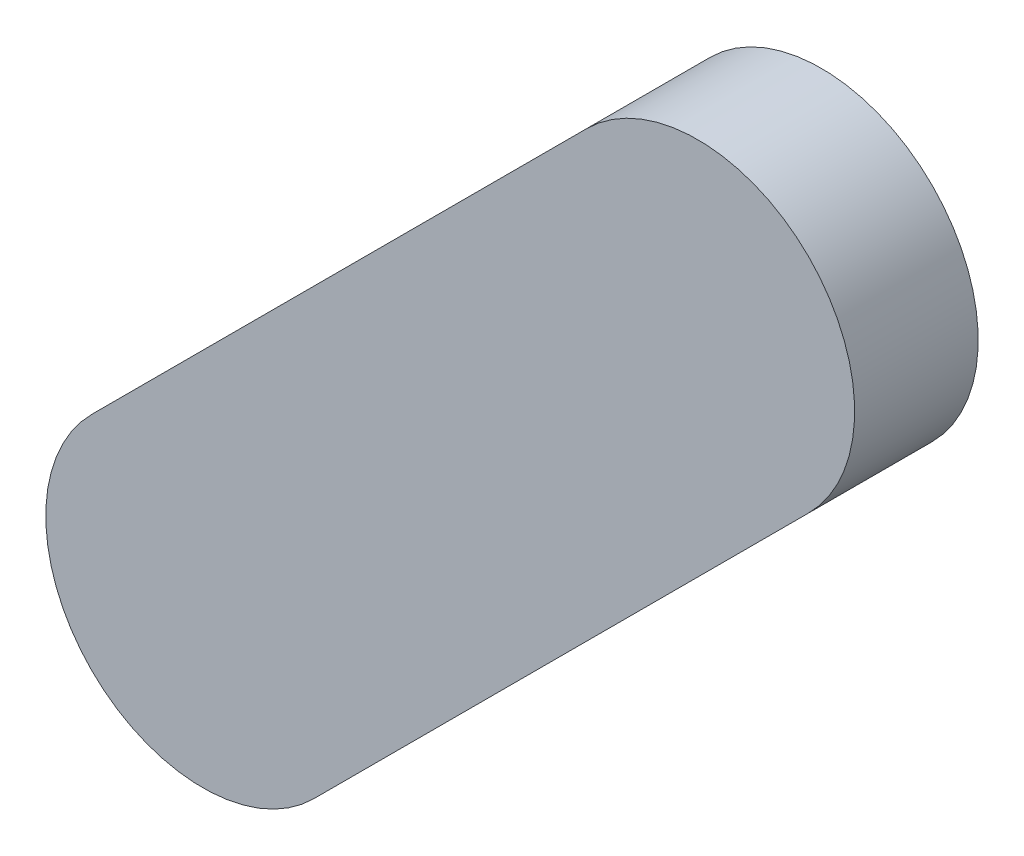
ISO-10303-21;
HEADER;
FILE_DESCRIPTION(('STEP AP214'),'2;1');
FILE_NAME('part.step','',(''),(''),'','','');
FILE_SCHEMA(('AUTOMOTIVE_DESIGN { 1 0 10303 214 1 1 1 1 }'));
ENDSEC;
DATA;
#1=APPLICATION_CONTEXT('core data for automotive mechanical design processes');
#2=APPLICATION_PROTOCOL_DEFINITION('international standard','automotive_design',2000,#1);
#3=PRODUCT_CONTEXT('',#1,'mechanical');
#4=PRODUCT('Part','Part','',(#3));
#5=PRODUCT_RELATED_PRODUCT_CATEGORY('part','',(#4));
#6=PRODUCT_DEFINITION_FORMATION('','',#4);
#7=PRODUCT_DEFINITION_CONTEXT('part definition',#1,'design');
#8=PRODUCT_DEFINITION('design','',#6,#7);
#9=PRODUCT_DEFINITION_SHAPE('','',#8);
#10=(LENGTH_UNIT() NAMED_UNIT(*) SI_UNIT(.MILLI.,.METRE.));
#11=(NAMED_UNIT(*) PLANE_ANGLE_UNIT() SI_UNIT($,.RADIAN.));
#12=(NAMED_UNIT(*) SI_UNIT($,.STERADIAN.) SOLID_ANGLE_UNIT());
#13=UNCERTAINTY_MEASURE_WITH_UNIT(LENGTH_MEASURE(1.E-05),#10,'distance_accuracy_value','');
#14=(GEOMETRIC_REPRESENTATION_CONTEXT(3) GLOBAL_UNCERTAINTY_ASSIGNED_CONTEXT((#13)) GLOBAL_UNIT_ASSIGNED_CONTEXT((#10,
#11,#12)) REPRESENTATION_CONTEXT('',''));
#15=CARTESIAN_POINT('',(0.,0.,0.));
#16=DIRECTION('',(0.,0.,1.));
#17=DIRECTION('',(1.,0.,0.));
#18=AXIS2_PLACEMENT_3D('',#15,#16,#17);
#19=CARTESIAN_POINT('',(154.1915382,71.40932886,0.));
#20=DIRECTION('',(-0.70710566014808,0.707107902223238,0.));
#21=DIRECTION('',(0.707107902223238,0.70710566014808,0.));
#22=AXIS2_PLACEMENT_3D('',#19,#20,#21);
#23=PLANE('',#22);
#24=DIRECTION('',(0.707107902223238,0.70710566014808,0.));
#25=VECTOR('',#24,1.);
#26=CARTESIAN_POINT('',(154.1915382,71.40932886,0.1999996));
#27=LINE('',#26,#25);
#28=CARTESIAN_POINT('',(154.1915382,71.40932886,0.1999996));
#29=VERTEX_POINT('',#28);
#30=CARTESIAN_POINT('',(154.99260594,72.21039406,0.1999996));
#31=VERTEX_POINT('',#30);
#32=EDGE_CURVE('E11',#29,#31,#27,.T.);
#33=ORIENTED_EDGE('',*,*,#32,.F.);
#34=DIRECTION('',(0.,0.,1.));
#35=VECTOR('',#34,1.);
#36=CARTESIAN_POINT('',(154.1915382,71.40932886,0.));
#37=LINE('',#36,#35);
#38=CARTESIAN_POINT('',(154.1915382,71.40932886,0.));
#39=VERTEX_POINT('',#38);
#40=EDGE_CURVE('E24',#39,#29,#37,.T.);
#41=ORIENTED_EDGE('',*,*,#40,.F.);
#42=DIRECTION('',(0.707107902223238,0.70710566014808,0.));
#43=VECTOR('',#42,1.);
#44=CARTESIAN_POINT('',(154.1915382,71.40932886,0.));
#45=LINE('',#44,#43);
#46=CARTESIAN_POINT('',(154.99260594,72.21039406,0.));
#47=VERTEX_POINT('',#46);
#48=EDGE_CURVE('E75',#39,#47,#45,.T.);
#49=ORIENTED_EDGE('',*,*,#48,.T.);
#50=DIRECTION('',(0.,0.,1.));
#51=VECTOR('',#50,1.);
#52=CARTESIAN_POINT('',(154.99260594,72.21039406,0.));
#53=LINE('',#52,#51);
#54=EDGE_CURVE('E37',#47,#31,#53,.T.);
#55=ORIENTED_EDGE('',*,*,#54,.T.);
#56=EDGE_LOOP('',(#33,#41,#49,#55));
#57=FACE_BOUND('',#56,.T.);
#58=ADVANCED_FACE('F17',(#57),#23,.F.);
#59=CARTESIAN_POINT('',(154.813,72.39,0.));
#60=DIRECTION('',(0.,0.,-1.));
#61=DIRECTION('',(0.707106781186576,-0.70710678118652,0.));
#62=AXIS2_PLACEMENT_3D('',#59,#60,#61);
#63=CYLINDRICAL_SURFACE('',#62,0.254001156230781);
#64=CARTESIAN_POINT('',(154.813,72.39,0.1999996));
#65=DIRECTION('',(0.,0.,1.));
#66=DIRECTION('',(0.707106781186576,-0.70710678118652,0.));
#67=AXIS2_PLACEMENT_3D('',#64,#65,#66);
#68=CIRCLE('',#67,0.254001156230781);
#69=CARTESIAN_POINT('',(154.63339406,72.56960594,0.1999996));
#70=VERTEX_POINT('',#69);
#71=EDGE_CURVE('E83',#31,#70,#68,.T.);
#72=ORIENTED_EDGE('',*,*,#71,.F.);
#73=ORIENTED_EDGE('',*,*,#54,.F.);
#74=CARTESIAN_POINT('',(154.813,72.39,0.));
#75=DIRECTION('',(0.,0.,1.));
#76=DIRECTION('',(0.707106781186576,-0.70710678118652,0.));
#77=AXIS2_PLACEMENT_3D('',#74,#75,#76);
#78=CIRCLE('',#77,0.254001156230781);
#79=CARTESIAN_POINT('',(154.63339406,72.56960594,0.));
#80=VERTEX_POINT('',#79);
#81=EDGE_CURVE('E81',#47,#80,#78,.T.);
#82=ORIENTED_EDGE('',*,*,#81,.T.);
#83=DIRECTION('',(0.,0.,1.));
#84=VECTOR('',#83,1.);
#85=CARTESIAN_POINT('',(154.63339406,72.56960594,0.));
#86=LINE('',#85,#84);
#87=EDGE_CURVE('E67',#80,#70,#86,.T.);
#88=ORIENTED_EDGE('',*,*,#87,.T.);
#89=EDGE_LOOP('',(#72,#73,#82,#88));
#90=FACE_BOUND('',#89,.T.);
#91=ADVANCED_FACE('F89',(#90),#63,.T.);
#92=CARTESIAN_POINT('',(154.63339406,72.56960594,0.));
#93=DIRECTION('',(0.707107902223244,-0.707105660148074,0.));
#94=DIRECTION('',(-0.707105660148074,-0.707107902223244,0.));
#95=AXIS2_PLACEMENT_3D('',#92,#93,#94);
#96=PLANE('',#95);
#97=DIRECTION('',(-0.707105660148074,-0.707107902223244,0.));
#98=VECTOR('',#97,1.);
#99=CARTESIAN_POINT('',(154.63339406,72.56960594,0.1999996));
#100=LINE('',#99,#98);
#101=CARTESIAN_POINT('',(153.83232886,71.7685382,0.1999996));
#102=VERTEX_POINT('',#101);
#103=EDGE_CURVE('E71',#70,#102,#100,.T.);
#104=ORIENTED_EDGE('',*,*,#103,.F.);
#105=ORIENTED_EDGE('',*,*,#87,.F.);
#106=DIRECTION('',(-0.707105660148074,-0.707107902223244,0.));
#107=VECTOR('',#106,1.);
#108=CARTESIAN_POINT('',(154.63339406,72.56960594,0.));
#109=LINE('',#108,#107);
#110=CARTESIAN_POINT('',(153.83232886,71.7685382,0.));
#111=VERTEX_POINT('',#110);
#112=EDGE_CURVE('E63',#80,#111,#109,.T.);
#113=ORIENTED_EDGE('',*,*,#112,.T.);
#114=DIRECTION('',(0.,0.,1.));
#115=VECTOR('',#114,1.);
#116=CARTESIAN_POINT('',(153.83232886,71.7685382,0.));
#117=LINE('',#116,#115);
#118=EDGE_CURVE('E53',#111,#102,#117,.T.);
#119=ORIENTED_EDGE('',*,*,#118,.T.);
#120=EDGE_LOOP('',(#104,#105,#113,#119));
#121=FACE_BOUND('',#120,.T.);
#122=ADVANCED_FACE('F66',(#121),#96,.F.);
#123=CARTESIAN_POINT('',(154.01193353,71.58893353,0.));
#124=DIRECTION('',(0.,0.,-1.));
#125=DIRECTION('',(-0.707106781186548,0.707106781186548,0.));
#126=AXIS2_PLACEMENT_3D('',#123,#124,#125);
#127=CYLINDRICAL_SURFACE('',#126,0.253999360179542);
#128=CARTESIAN_POINT('',(154.01193353,71.58893353,0.1999996));
#129=DIRECTION('',(0.,0.,1.));
#130=DIRECTION('',(-0.707106781186548,0.707106781186548,0.));
#131=AXIS2_PLACEMENT_3D('',#128,#129,#130);
#132=CIRCLE('',#131,0.253999360179542);
#133=EDGE_CURVE('E59',#102,#29,#132,.T.);
#134=ORIENTED_EDGE('',*,*,#133,.F.);
#135=ORIENTED_EDGE('',*,*,#118,.F.);
#136=CARTESIAN_POINT('',(154.01193353,71.58893353,0.));
#137=DIRECTION('',(0.,0.,1.));
#138=DIRECTION('',(-0.707106781186548,0.707106781186548,0.));
#139=AXIS2_PLACEMENT_3D('',#136,#137,#138);
#140=CIRCLE('',#139,0.253999360179542);
#141=EDGE_CURVE('E57',#111,#39,#140,.T.);
#142=ORIENTED_EDGE('',*,*,#141,.T.);
#143=ORIENTED_EDGE('',*,*,#40,.T.);
#144=EDGE_LOOP('',(#134,#135,#142,#143));
#145=FACE_BOUND('',#144,.T.);
#146=ADVANCED_FACE('F55',(#145),#127,.T.);
#147=CARTESIAN_POINT('',(154.1915382,71.40932886,0.));
#148=DIRECTION('',(0.,0.,-1.));
#149=DIRECTION('',(-1.,0.,0.));
#150=AXIS2_PLACEMENT_3D('',#147,#148,#149);
#151=PLANE('',#150);
#152=ORIENTED_EDGE('',*,*,#141,.F.);
#153=ORIENTED_EDGE('',*,*,#112,.F.);
#154=ORIENTED_EDGE('',*,*,#81,.F.);
#155=ORIENTED_EDGE('',*,*,#48,.F.);
#156=EDGE_LOOP('',(#152,#153,#154,#155));
#157=FACE_BOUND('',#156,.T.);
#158=ADVANCED_FACE('F74',(#157),#151,.T.);
#159=CARTESIAN_POINT('',(154.1915382,71.40932886,0.1999996));
#160=DIRECTION('',(0.,0.,-1.));
#161=DIRECTION('',(-1.,0.,0.));
#162=AXIS2_PLACEMENT_3D('',#159,#160,#161);
#163=PLANE('',#162);
#164=ORIENTED_EDGE('',*,*,#32,.T.);
#165=ORIENTED_EDGE('',*,*,#71,.T.);
#166=ORIENTED_EDGE('',*,*,#103,.T.);
#167=ORIENTED_EDGE('',*,*,#133,.T.);
#168=EDGE_LOOP('',(#164,#165,#166,#167));
#169=FACE_BOUND('',#168,.T.);
#170=ADVANCED_FACE('F91',(#169),#163,.F.);
#171=CLOSED_SHELL('',(#58,#91,#122,#146,#158,#170));
#172=MANIFOLD_SOLID_BREP('B1',#171);
#173=ADVANCED_BREP_SHAPE_REPRESENTATION('',(#18,#172),#14);
#174=SHAPE_DEFINITION_REPRESENTATION(#9,#173);
ENDSEC;
END-ISO-10303-21;
